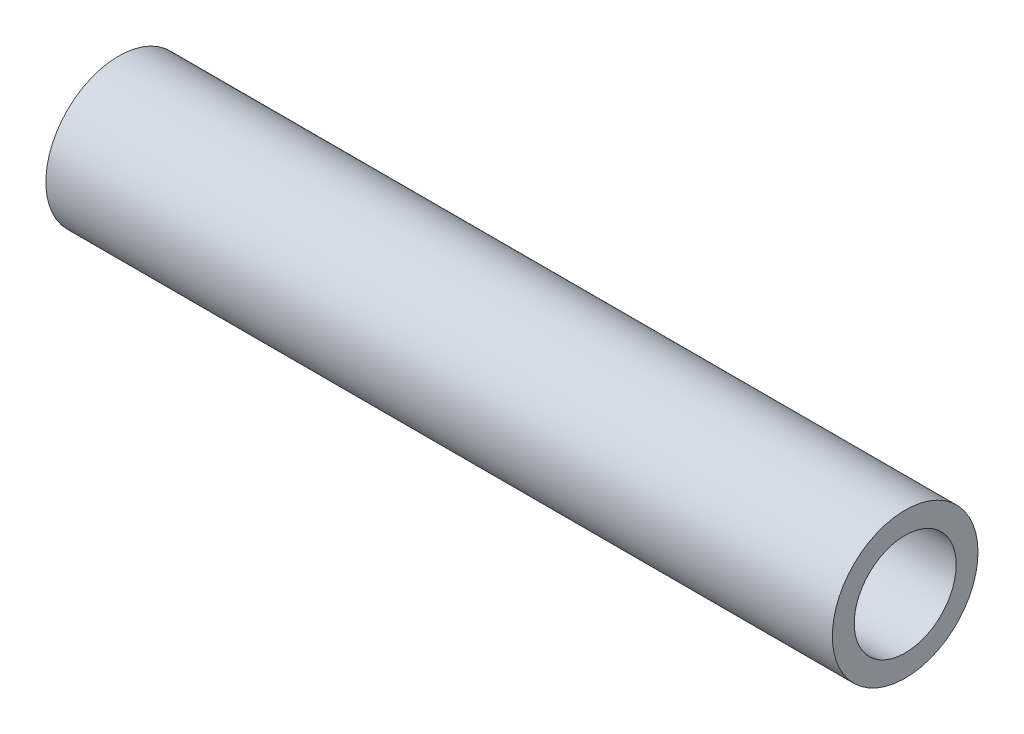
ISO-10303-21;
HEADER;
FILE_DESCRIPTION(('STEP AP214'),'2;1');
FILE_NAME('part.step','',(''),(''),'','','');
FILE_SCHEMA(('AUTOMOTIVE_DESIGN { 1 0 10303 214 1 1 1 1 }'));
ENDSEC;
DATA;
#1=APPLICATION_CONTEXT('core data for automotive mechanical design processes');
#2=APPLICATION_PROTOCOL_DEFINITION('international standard','automotive_design',2000,#1);
#3=PRODUCT_CONTEXT('',#1,'mechanical');
#4=PRODUCT('Part','Part','',(#3));
#5=PRODUCT_RELATED_PRODUCT_CATEGORY('part','',(#4));
#6=PRODUCT_DEFINITION_FORMATION('','',#4);
#7=PRODUCT_DEFINITION_CONTEXT('part definition',#1,'design');
#8=PRODUCT_DEFINITION('design','',#6,#7);
#9=PRODUCT_DEFINITION_SHAPE('','',#8);
#10=(LENGTH_UNIT() NAMED_UNIT(*) SI_UNIT(.MILLI.,.METRE.));
#11=(NAMED_UNIT(*) PLANE_ANGLE_UNIT() SI_UNIT($,.RADIAN.));
#12=(NAMED_UNIT(*) SI_UNIT($,.STERADIAN.) SOLID_ANGLE_UNIT());
#13=UNCERTAINTY_MEASURE_WITH_UNIT(LENGTH_MEASURE(1.E-05),#10,'distance_accuracy_value','');
#14=(GEOMETRIC_REPRESENTATION_CONTEXT(3) GLOBAL_UNCERTAINTY_ASSIGNED_CONTEXT((#13)) GLOBAL_UNIT_ASSIGNED_CONTEXT((#10,
#11,#12)) REPRESENTATION_CONTEXT('',''));
#15=CARTESIAN_POINT('',(0.,0.,0.));
#16=DIRECTION('',(0.,0.,1.));
#17=DIRECTION('',(1.,0.,0.));
#18=AXIS2_PLACEMENT_3D('',#15,#16,#17);
#19=CARTESIAN_POINT('',(-13.5,0.,0.));
#20=DIRECTION('',(1.,0.,0.));
#21=DIRECTION('',(0.,0.,-1.));
#22=AXIS2_PLACEMENT_3D('',#19,#20,#21);
#23=CYLINDRICAL_SURFACE('',#22,2.5);
#24=CARTESIAN_POINT('',(-13.5,0.,0.));
#25=DIRECTION('',(1.,0.,0.));
#26=DIRECTION('',(0.,0.,-1.));
#27=AXIS2_PLACEMENT_3D('',#24,#25,#26);
#28=CIRCLE('',#27,2.5);
#29=CARTESIAN_POINT('',(-13.5,0.,-2.5));
#30=VERTEX_POINT('',#29);
#31=EDGE_CURVE('E10',#30,#30,#28,.T.);
#32=ORIENTED_EDGE('',*,*,#31,.T.);
#33=EDGE_LOOP('',(#32));
#34=FACE_BOUND('',#33,.T.);
#35=CARTESIAN_POINT('',(13.5,0.,0.));
#36=DIRECTION('',(1.,0.,0.));
#37=DIRECTION('',(0.,0.,-1.));
#38=AXIS2_PLACEMENT_3D('',#35,#36,#37);
#39=CIRCLE('',#38,2.5);
#40=CARTESIAN_POINT('',(13.5,0.,-2.5));
#41=VERTEX_POINT('',#40);
#42=EDGE_CURVE('E40',#41,#41,#39,.T.);
#43=ORIENTED_EDGE('',*,*,#42,.F.);
#44=EDGE_LOOP('',(#43));
#45=FACE_BOUND('',#44,.T.);
#46=ADVANCED_FACE('F30',(#34,#45),#23,.T.);
#47=CARTESIAN_POINT('',(-13.5,0.,0.));
#48=DIRECTION('',(1.,0.,0.));
#49=DIRECTION('',(0.,0.,-1.));
#50=AXIS2_PLACEMENT_3D('',#47,#48,#49);
#51=PLANE('',#50);
#52=CARTESIAN_POINT('',(-13.5,0.,0.));
#53=DIRECTION('',(1.,0.,0.));
#54=DIRECTION('',(0.,0.,-1.));
#55=AXIS2_PLACEMENT_3D('',#52,#53,#54);
#56=CIRCLE('',#55,1.75);
#57=CARTESIAN_POINT('',(-13.5,0.,-1.75));
#58=VERTEX_POINT('',#57);
#59=EDGE_CURVE('E36',#58,#58,#56,.T.);
#60=ORIENTED_EDGE('',*,*,#59,.T.);
#61=EDGE_LOOP('',(#60));
#62=FACE_BOUND('',#61,.T.);
#63=ORIENTED_EDGE('',*,*,#31,.F.);
#64=EDGE_LOOP('',(#63));
#65=FACE_BOUND('',#64,.T.);
#66=ADVANCED_FACE('F59',(#62,#65),#51,.F.);
#67=CARTESIAN_POINT('',(-13.5,0.,0.));
#68=DIRECTION('',(1.,0.,0.));
#69=DIRECTION('',(0.,0.,-1.));
#70=AXIS2_PLACEMENT_3D('',#67,#68,#69);
#71=CYLINDRICAL_SURFACE('',#70,1.75);
#72=ORIENTED_EDGE('',*,*,#59,.F.);
#73=EDGE_LOOP('',(#72));
#74=FACE_BOUND('',#73,.T.);
#75=CARTESIAN_POINT('',(13.5,0.,0.));
#76=DIRECTION('',(1.,0.,0.));
#77=DIRECTION('',(0.,0.,-1.));
#78=AXIS2_PLACEMENT_3D('',#75,#76,#77);
#79=CIRCLE('',#78,1.75);
#80=CARTESIAN_POINT('',(13.5,0.,-1.75));
#81=VERTEX_POINT('',#80);
#82=EDGE_CURVE('E44',#81,#81,#79,.T.);
#83=ORIENTED_EDGE('',*,*,#82,.T.);
#84=EDGE_LOOP('',(#83));
#85=FACE_BOUND('',#84,.T.);
#86=ADVANCED_FACE('F50',(#74,#85),#71,.F.);
#87=CARTESIAN_POINT('',(13.5,0.,0.));
#88=DIRECTION('',(1.,0.,0.));
#89=DIRECTION('',(0.,0.,-1.));
#90=AXIS2_PLACEMENT_3D('',#87,#88,#89);
#91=PLANE('',#90);
#92=ORIENTED_EDGE('',*,*,#42,.T.);
#93=EDGE_LOOP('',(#92));
#94=FACE_BOUND('',#93,.T.);
#95=ORIENTED_EDGE('',*,*,#82,.F.);
#96=EDGE_LOOP('',(#95));
#97=FACE_BOUND('',#96,.T.);
#98=ADVANCED_FACE('F52',(#94,#97),#91,.T.);
#99=CLOSED_SHELL('',(#46,#66,#86,#98));
#100=MANIFOLD_SOLID_BREP('B2',#99);
#101=ADVANCED_BREP_SHAPE_REPRESENTATION('',(#18,#100),#14);
#102=SHAPE_DEFINITION_REPRESENTATION(#9,#101);
ENDSEC;
END-ISO-10303-21;
